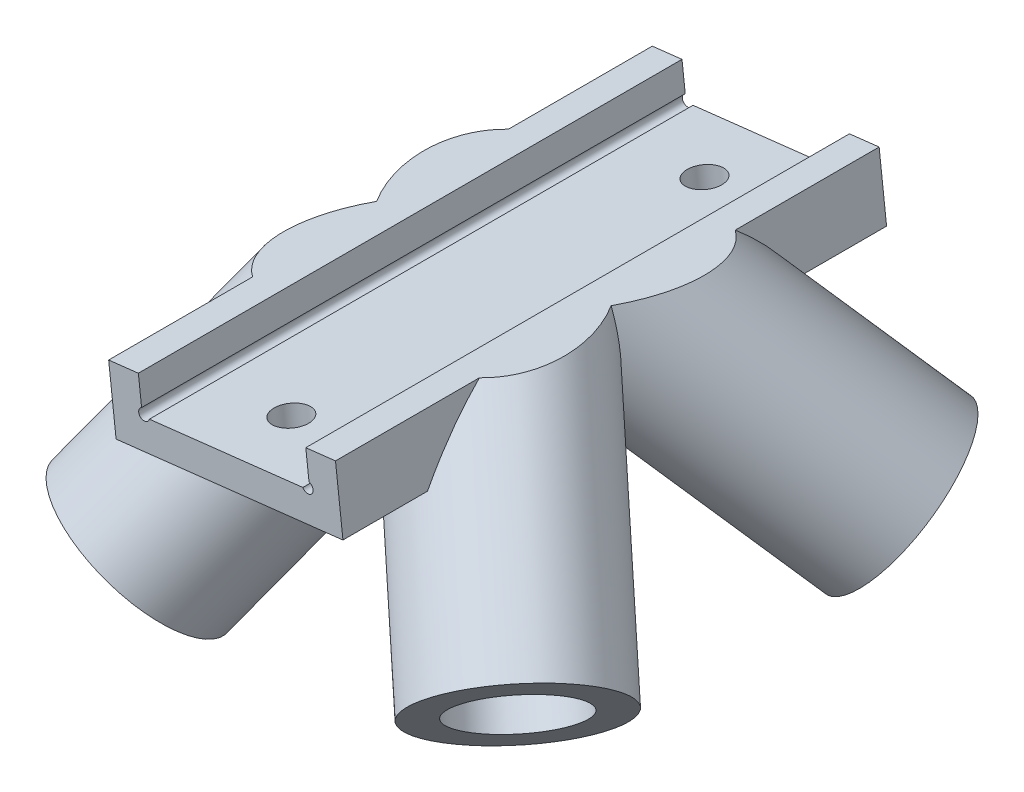
ISO-10303-21;
HEADER;
FILE_DESCRIPTION(('STEP AP214'),'2;1');
FILE_NAME('part.step','',(''),(''),'','','');
FILE_SCHEMA(('AUTOMOTIVE_DESIGN { 1 0 10303 214 1 1 1 1 }'));
ENDSEC;
DATA;
#1=APPLICATION_CONTEXT('core data for automotive mechanical design processes');
#2=APPLICATION_PROTOCOL_DEFINITION('international standard','automotive_design',2000,#1);
#3=PRODUCT_CONTEXT('',#1,'mechanical');
#4=PRODUCT('Part','Part','',(#3));
#5=PRODUCT_RELATED_PRODUCT_CATEGORY('part','',(#4));
#6=PRODUCT_DEFINITION_FORMATION('','',#4);
#7=PRODUCT_DEFINITION_CONTEXT('part definition',#1,'design');
#8=PRODUCT_DEFINITION('design','',#6,#7);
#9=PRODUCT_DEFINITION_SHAPE('','',#8);
#10=(LENGTH_UNIT() NAMED_UNIT(*) SI_UNIT(.MILLI.,.METRE.));
#11=(NAMED_UNIT(*) PLANE_ANGLE_UNIT() SI_UNIT($,.RADIAN.));
#12=(NAMED_UNIT(*) SI_UNIT($,.STERADIAN.) SOLID_ANGLE_UNIT());
#13=UNCERTAINTY_MEASURE_WITH_UNIT(LENGTH_MEASURE(1.E-05),#10,'distance_accuracy_value','');
#14=(GEOMETRIC_REPRESENTATION_CONTEXT(3) GLOBAL_UNCERTAINTY_ASSIGNED_CONTEXT((#13)) GLOBAL_UNIT_ASSIGNED_CONTEXT((#10,
#11,#12)) REPRESENTATION_CONTEXT('',''));
#15=CARTESIAN_POINT('',(0.,0.,0.));
#16=DIRECTION('',(0.,0.,1.));
#17=DIRECTION('',(1.,0.,0.));
#18=AXIS2_PLACEMENT_3D('',#15,#16,#17);
#19=CARTESIAN_POINT('',(-11.6292554105229,9.2336568377227,25.));
#20=DIRECTION('',(0.99347201182122,0.114076122514297,0.));
#21=DIRECTION('',(-0.114076122514297,0.993472011821221,0.));
#22=AXIS2_PLACEMENT_3D('',#19,#20,#21);
#23=PLANE('',#22);
#24=DIRECTION('',(0.114076122514297,-0.99347201182122,0.));
#25=VECTOR('',#24,1.);
#26=CARTESIAN_POINT('',(-11.6292554105229,9.2336568377227,25.));
#27=LINE('',#26,#25);
#28=CARTESIAN_POINT('',(-9.91811357280848,-5.6684233395956,25.));
#29=VERTEX_POINT('',#28);
#30=CARTESIAN_POINT('',(-9.2336568377227,-11.6292554105229,25.));
#31=VERTEX_POINT('',#30);
#32=EDGE_CURVE('E218',#29,#31,#27,.T.);
#33=ORIENTED_EDGE('',*,*,#32,.F.);
#34=DIRECTION('',(0.,0.,-1.));
#35=VECTOR('',#34,1.);
#36=CARTESIAN_POINT('',(-9.91811357280848,-5.6684233395956,25.));
#37=LINE('',#36,#35);
#38=CARTESIAN_POINT('',(-9.91811357280848,-5.6684233395956,11.7638200751838));
#39=VERTEX_POINT('',#38);
#40=EDGE_CURVE('E202',#29,#39,#37,.T.);
#41=ORIENTED_EDGE('',*,*,#40,.T.);
#42=CARTESIAN_POINT('',(-8.73751212829496,-15.9501060124345,10.4999999999999));
#43=DIRECTION('',(0.99347201182122,0.114076122514297,0.));
#44=DIRECTION('',(-0.093142763998416,0.811166500899417,-0.577350269189624));
#45=AXIS2_PLACEMENT_3D('',#42,#43,#44);
#46=ELLIPSE('',#45,16.,8.);
#47=CARTESIAN_POINT('',(-9.2336568377227,-11.6292554105229,17.2205092622377));
#48=VERTEX_POINT('',#47);
#49=EDGE_CURVE('E251',#48,#39,#46,.F.);
#50=ORIENTED_EDGE('',*,*,#49,.F.);
#51=DIRECTION('',(0.,0.,-1.));
#52=VECTOR('',#51,1.);
#53=CARTESIAN_POINT('',(-9.2336568377227,-11.6292554105229,25.));
#54=LINE('',#53,#52);
#55=EDGE_CURVE('E226',#31,#48,#54,.T.);
#56=ORIENTED_EDGE('',*,*,#55,.F.);
#57=EDGE_LOOP('',(#33,#41,#50,#56));
#58=FACE_BOUND('',#57,.T.);
#59=ADVANCED_FACE('F89',(#58),#23,.F.);
#60=CARTESIAN_POINT('',(9.2336568377227,11.6292554105229,25.));
#61=DIRECTION('',(0.99347201182122,0.114076122514297,0.));
#62=DIRECTION('',(-0.114076122514297,0.993472011821221,0.));
#63=AXIS2_PLACEMENT_3D('',#60,#61,#62);
#64=PLANE('',#63);
#65=DIRECTION('',(0.,0.,-1.));
#66=VECTOR('',#65,1.);
#67=CARTESIAN_POINT('',(10.9447986754372,-3.27282476679537,25.));
#68=LINE('',#67,#66);
#69=CARTESIAN_POINT('',(10.9447986754371,-3.27282476679537,25.));
#70=VERTEX_POINT('',#69);
#71=CARTESIAN_POINT('',(10.9447986754372,-3.27282476679537,11.7638200751838));
#72=VERTEX_POINT('',#71);
#73=EDGE_CURVE('E317',#70,#72,#68,.T.);
#74=ORIENTED_EDGE('',*,*,#73,.F.);
#75=DIRECTION('',(0.114076122514297,-0.99347201182122,0.));
#76=VECTOR('',#75,1.);
#77=CARTESIAN_POINT('',(9.2336568377227,11.6292554105229,25.));
#78=LINE('',#77,#76);
#79=CARTESIAN_POINT('',(11.6292554105229,-9.2336568377227,25.));
#80=VERTEX_POINT('',#79);
#81=EDGE_CURVE('E241',#70,#80,#78,.T.);
#82=ORIENTED_EDGE('',*,*,#81,.T.);
#83=DIRECTION('',(0.,0.,-1.));
#84=VECTOR('',#83,1.);
#85=CARTESIAN_POINT('',(11.6292554105229,-9.2336568377227,25.));
#86=LINE('',#85,#84);
#87=CARTESIAN_POINT('',(11.6292554105229,-9.2336568377227,17.2205092622377));
#88=VERTEX_POINT('',#87);
#89=EDGE_CURVE('E248',#80,#88,#86,.T.);
#90=ORIENTED_EDGE('',*,*,#89,.T.);
#91=CARTESIAN_POINT('',(12.1254001199507,-13.5545074396342,10.4999999999999));
#92=DIRECTION('',(0.99347201182122,0.114076122514297,0.));
#93=DIRECTION('',(-0.0931427639984159,0.811166500899417,-0.577350269189624));
#94=AXIS2_PLACEMENT_3D('',#91,#92,#93);
#95=ELLIPSE('',#94,16.,8.);
#96=EDGE_CURVE('E244',#88,#72,#95,.F.);
#97=ORIENTED_EDGE('',*,*,#96,.T.);
#98=EDGE_LOOP('',(#74,#82,#90,#97));
#99=FACE_BOUND('',#98,.T.);
#100=ADVANCED_FACE('F389',(#99),#64,.T.);
#101=CARTESIAN_POINT('',(11.6292554105229,-9.2336568377227,25.));
#102=DIRECTION('',(0.114076122514297,-0.99347201182122,0.));
#103=DIRECTION('',(0.993472011821221,0.114076122514297,0.));
#104=AXIS2_PLACEMENT_3D('',#101,#102,#103);
#105=PLANE('',#104);
#106=ORIENTED_EDGE('',*,*,#55,.T.);
#107=CARTESIAN_POINT('',(-6.17835407661707,-11.2784281220367,7.42462120245871));
#108=DIRECTION('',(0.114076122514297,-0.99347201182122,0.));
#109=DIRECTION('',(0.702490796477829,0.0806639998013268,-0.707106781186545));
#110=AXIS2_PLACEMENT_3D('',#107,#108,#109);
#111=ELLIPSE('',#110,11.3137084989847,8.);
#112=CARTESIAN_POINT('',(1.19779928640012,-10.4314561241228,10.9774612416475));
#113=VERTEX_POINT('',#112);
#114=EDGE_CURVE('E230',#48,#113,#111,.F.);
#115=ORIENTED_EDGE('',*,*,#114,.T.);
#116=CARTESIAN_POINT('',(8.57395264941731,-9.58448412620888,7.42462120245871));
#117=DIRECTION('',(0.114076122514297,-0.99347201182122,0.));
#118=DIRECTION('',(-0.702490796477829,-0.0806639998013269,-0.707106781186545));
#119=AXIS2_PLACEMENT_3D('',#116,#117,#118);
#120=ELLIPSE('',#119,11.3137084989848,8.);
#121=EDGE_CURVE('E240',#113,#88,#120,.F.);
#122=ORIENTED_EDGE('',*,*,#121,.T.);
#123=ORIENTED_EDGE('',*,*,#89,.F.);
#124=DIRECTION('',(-0.99347201182122,-0.114076122514297,0.));
#125=VECTOR('',#124,1.);
#126=CARTESIAN_POINT('',(11.6292554105229,-9.2336568377227,25.));
#127=LINE('',#126,#125);
#128=EDGE_CURVE('E237',#80,#31,#127,.T.);
#129=ORIENTED_EDGE('',*,*,#128,.T.);
#130=EDGE_LOOP('',(#106,#115,#122,#123,#129));
#131=FACE_BOUND('',#130,.T.);
#132=CARTESIAN_POINT('',(1.19779928640012,-10.4314561241228,19.));
#133=DIRECTION('',(-0.114076122514297,0.99347201182122,0.));
#134=DIRECTION('',(-0.99347201182122,-0.114076122514297,0.));
#135=AXIS2_PLACEMENT_3D('',#132,#133,#134);
#136=CIRCLE('',#135,1.6);
#137=CARTESIAN_POINT('',(-0.391755932513838,-10.6139779201457,19.));
#138=VERTEX_POINT('',#137);
#139=EDGE_CURVE('E233',#138,#138,#136,.T.);
#140=ORIENTED_EDGE('',*,*,#139,.T.);
#141=EDGE_LOOP('',(#140));
#142=FACE_BOUND('',#141,.T.);
#143=ADVANCED_FACE('F392',(#131,#142),#105,.T.);
#144=CARTESIAN_POINT('',(0.884089949485796,-7.69940809161446,0.));
#145=DIRECTION('',(0.114076122514296,-0.99347201182122,0.));
#146=DIRECTION('',(0.99347201182122,0.114076122514296,0.));
#147=AXIS2_PLACEMENT_3D('',#144,#145,#146);
#148=PLANE('',#147);
#149=DIRECTION('',(0.993472011821221,0.114076122514296,0.));
#150=VECTOR('',#149,1.);
#151=CARTESIAN_POINT('',(0.884089949485797,-7.69940809161446,25.));
#152=LINE('',#151,#150);
#153=CARTESIAN_POINT('',(-6.17504145656119,-8.5099778203424,25.));
#154=VERTEX_POINT('',#153);
#155=CARTESIAN_POINT('',(7.9432213555328,-6.88883836288651,25.));
#156=VERTEX_POINT('',#155);
#157=EDGE_CURVE('E289',#154,#156,#152,.T.);
#158=ORIENTED_EDGE('',*,*,#157,.T.);
#159=DIRECTION('',(0.,0.,1.));
#160=VECTOR('',#159,1.);
#161=CARTESIAN_POINT('',(7.9432213555328,-6.88883836288651,0.));
#162=LINE('',#161,#160);
#163=CARTESIAN_POINT('',(7.9432213555328,-6.88883836288651,-25.));
#164=VERTEX_POINT('',#163);
#165=EDGE_CURVE('E283',#164,#156,#162,.T.);
#166=ORIENTED_EDGE('',*,*,#165,.F.);
#167=DIRECTION('',(0.993472011821221,0.114076122514296,0.));
#168=VECTOR('',#167,1.);
#169=CARTESIAN_POINT('',(0.884089949485797,-7.69940809161446,-25.));
#170=LINE('',#169,#168);
#171=CARTESIAN_POINT('',(-6.17504145656119,-8.5099778203424,-25.));
#172=VERTEX_POINT('',#171);
#173=EDGE_CURVE('E379',#172,#164,#170,.T.);
#174=ORIENTED_EDGE('',*,*,#173,.F.);
#175=DIRECTION('',(0.,0.,1.));
#176=VECTOR('',#175,1.);
#177=CARTESIAN_POINT('',(-6.17504145656119,-8.5099778203424,0.));
#178=LINE('',#177,#176);
#179=EDGE_CURVE('E286',#172,#154,#178,.T.);
#180=ORIENTED_EDGE('',*,*,#179,.T.);
#181=EDGE_LOOP('',(#158,#166,#174,#180));
#182=FACE_BOUND('',#181,.T.);
#183=CARTESIAN_POINT('',(0.8840899494858,-7.69940809161446,19.));
#184=DIRECTION('',(0.114076122514296,-0.99347201182122,0.));
#185=DIRECTION('',(0.99347201182122,0.114076122514296,0.));
#186=AXIS2_PLACEMENT_3D('',#183,#184,#185);
#187=CIRCLE('',#186,1.6);
#188=CARTESIAN_POINT('',(2.47364516839975,-7.51688629559159,19.));
#189=VERTEX_POINT('',#188);
#190=EDGE_CURVE('E228',#189,#189,#187,.T.);
#191=ORIENTED_EDGE('',*,*,#190,.T.);
#192=EDGE_LOOP('',(#191));
#193=FACE_BOUND('',#192,.T.);
#194=CARTESIAN_POINT('',(0.8840899494858,-7.69940809161446,-19.));
#195=DIRECTION('',(-0.114076122514296,0.99347201182122,0.));
#196=DIRECTION('',(0.99347201182122,0.114076122514296,0.));
#197=AXIS2_PLACEMENT_3D('',#194,#195,#196);
#198=CIRCLE('',#197,1.6);
#199=CARTESIAN_POINT('',(2.47364516839975,-7.51688629559159,-19.));
#200=VERTEX_POINT('',#199);
#201=EDGE_CURVE('E324',#200,#200,#198,.T.);
#202=ORIENTED_EDGE('',*,*,#201,.F.);
#203=EDGE_LOOP('',(#202));
#204=FACE_BOUND('',#203,.T.);
#205=ADVANCED_FACE('F425',(#182,#193,#204),#148,.F.);
#206=CARTESIAN_POINT('',(0.,0.,25.));
#207=DIRECTION('',(0.,0.,-1.));
#208=DIRECTION('',(0.,1.,0.));
#209=AXIS2_PLACEMENT_3D('',#206,#207,#208);
#210=PLANE('',#209);
#211=ORIENTED_EDGE('',*,*,#81,.F.);
#212=DIRECTION('',(0.993472011821221,0.114076122514297,0.));
#213=VECTOR('',#212,1.);
#214=CARTESIAN_POINT('',(-31.0408053589941,-8.09385128055532,25.));
#215=LINE('',#214,#213);
#216=CARTESIAN_POINT('',(8.2127506429288,-3.58653410370968,25.));
#217=VERTEX_POINT('',#216);
#218=EDGE_CURVE('E223',#217,#70,#215,.T.);
#219=ORIENTED_EDGE('',*,*,#218,.F.);
#220=DIRECTION('',(-0.114076122514297,0.993472011821221,0.));
#221=VECTOR('',#220,1.);
#222=CARTESIAN_POINT('',(7.69940809161447,0.884089949485802,25.));
#223=LINE('',#222,#221);
#224=CARTESIAN_POINT('',(8.50997782034242,-6.1750414565612,25.));
#225=VERTEX_POINT('',#224);
#226=EDGE_CURVE('E285',#225,#217,#223,.T.);
#227=ORIENTED_EDGE('',*,*,#226,.F.);
#228=CARTESIAN_POINT('',(8.38770934203048,-6.65986144295953,25.));
#229=DIRECTION('',(0.,0.,1.));
#230=DIRECTION('',(1.,0.,0.));
#231=AXIS2_PLACEMENT_3D('',#228,#229,#230);
#232=CIRCLE('',#231,0.500000000000002);
#233=EDGE_CURVE('E280',#156,#225,#232,.T.);
#234=ORIENTED_EDGE('',*,*,#233,.F.);
#235=ORIENTED_EDGE('',*,*,#157,.F.);
#236=CARTESIAN_POINT('',(-6.65986144295953,-8.38770934203047,25.));
#237=DIRECTION('',(0.,0.,1.));
#238=DIRECTION('',(1.,0.,0.));
#239=AXIS2_PLACEMENT_3D('',#236,#237,#238);
#240=CIRCLE('',#239,0.5);
#241=CARTESIAN_POINT('',(-6.88883836288651,-7.94322135553281,25.));
#242=VERTEX_POINT('',#241);
#243=EDGE_CURVE('E276',#242,#154,#240,.T.);
#244=ORIENTED_EDGE('',*,*,#243,.F.);
#245=DIRECTION('',(0.114076122514297,-0.993472011821221,0.));
#246=VECTOR('',#245,1.);
#247=CARTESIAN_POINT('',(-7.69940809161447,-0.884089949485802,25.));
#248=LINE('',#247,#246);
#249=CARTESIAN_POINT('',(-7.18606554030013,-5.35471400268129,25.));
#250=VERTEX_POINT('',#249);
#251=EDGE_CURVE('E221',#250,#242,#248,.T.);
#252=ORIENTED_EDGE('',*,*,#251,.F.);
#253=EDGE_CURVE('E205',#29,#250,#215,.T.);
#254=ORIENTED_EDGE('',*,*,#253,.F.);
#255=ORIENTED_EDGE('',*,*,#32,.T.);
#256=ORIENTED_EDGE('',*,*,#128,.F.);
#257=EDGE_LOOP('',(#211,#219,#227,#234,#235,#244,#252,#254,#255,#256));
#258=FACE_BOUND('',#257,.T.);
#259=ADVANCED_FACE('F91',(#258),#210,.F.);
#260=CARTESIAN_POINT('',(-8.73751212829496,-15.9501060124345,-10.4999999999999));
#261=DIRECTION('',(-0.99347201182122,-0.114076122514297,0.));
#262=DIRECTION('',(-0.093142763998416,0.811166500899417,0.577350269189624));
#263=AXIS2_PLACEMENT_3D('',#260,#261,#262);
#264=ELLIPSE('',#263,16.,8.);
#265=CARTESIAN_POINT('',(-9.2336568377227,-11.6292554105229,-17.2205092622377));
#266=VERTEX_POINT('',#265);
#267=CARTESIAN_POINT('',(-9.91811357280848,-5.6684233395956,-11.7638200751838));
#268=VERTEX_POINT('',#267);
#269=EDGE_CURVE('E352',#266,#268,#264,.F.);
#270=ORIENTED_EDGE('',*,*,#269,.T.);
#271=CARTESIAN_POINT('',(-9.91811357280848,-5.6684233395956,-25.));
#272=VERTEX_POINT('',#271);
#273=EDGE_CURVE('E112',#268,#272,#37,.T.);
#274=ORIENTED_EDGE('',*,*,#273,.T.);
#275=DIRECTION('',(0.114076122514297,-0.99347201182122,0.));
#276=VECTOR('',#275,1.);
#277=CARTESIAN_POINT('',(-11.6292554105229,9.2336568377227,-25.));
#278=LINE('',#277,#276);
#279=CARTESIAN_POINT('',(-9.2336568377227,-11.6292554105229,-25.));
#280=VERTEX_POINT('',#279);
#281=EDGE_CURVE('E327',#272,#280,#278,.T.);
#282=ORIENTED_EDGE('',*,*,#281,.T.);
#283=DIRECTION('',(0.,0.,1.));
#284=VECTOR('',#283,1.);
#285=CARTESIAN_POINT('',(-9.2336568377227,-11.6292554105229,-25.));
#286=LINE('',#285,#284);
#287=EDGE_CURVE('E335',#280,#266,#286,.T.);
#288=ORIENTED_EDGE('',*,*,#287,.T.);
#289=EDGE_LOOP('',(#270,#274,#282,#288));
#290=FACE_BOUND('',#289,.T.);
#291=ADVANCED_FACE('F449',(#290),#23,.F.);
#292=CARTESIAN_POINT('',(20.2090001999178,-22.5908457327238,17.4999999999999));
#293=DIRECTION('',(-0.577400005711938,0.645452735220679,-0.499999999999998));
#294=DIRECTION('',(-0.745304620857677,-0.666724097455757,0.));
#295=AXIS2_PLACEMENT_3D('',#292,#293,#294);
#296=CYLINDRICAL_SURFACE('',#295,8.);
#297=CARTESIAN_POINT('',(20.2090001999178,-22.5908457327238,17.4999999999999));
#298=DIRECTION('',(0.577400005711938,-0.645452735220679,0.499999999999998));
#299=DIRECTION('',(0.745304620857677,0.666724097455757,0.));
#300=AXIS2_PLACEMENT_3D('',#297,#298,#299);
#301=CIRCLE('',#300,8.);
#302=CARTESIAN_POINT('',(26.1714371667793,-17.2570529530777,17.4999999999999));
#303=VERTEX_POINT('',#302);
#304=EDGE_CURVE('E243',#303,#303,#301,.T.);
#305=ORIENTED_EDGE('',*,*,#304,.F.);
#306=EDGE_LOOP('',(#305));
#307=FACE_BOUND('',#306,.T.);
#308=CARTESIAN_POINT('',(0.,0.,0.));
#309=DIRECTION('',(0.,0.,1.));
#310=DIRECTION('',(-0.666724097455757,0.745304620857677,0.));
#311=AXIS2_PLACEMENT_3D('',#308,#309,#310);
#312=ELLIPSE('',#311,16.0000000000001,8.);
#313=CARTESIAN_POINT('',(1.29062399682123,-11.2398527436452,0.));
#314=VERTEX_POINT('',#313);
#315=CARTESIAN_POINT('',(11.3006755418618,-3.23196095530274,0.));
#316=VERTEX_POINT('',#315);
#317=EDGE_CURVE('E239',#314,#316,#312,.T.);
#318=ORIENTED_EDGE('',*,*,#317,.T.);
#319=CARTESIAN_POINT('',(3.67455113546455,-4.10763605408952,3.18198051533944));
#320=DIRECTION('',(0.114076122514297,-0.99347201182122,0.));
#321=DIRECTION('',(-0.702490796477829,-0.0806639998013269,-0.707106781186545));
#322=AXIS2_PLACEMENT_3D('',#319,#320,#321);
#323=ELLIPSE('',#322,11.3137084989848,8.);
#324=EDGE_CURVE('E104',#316,#72,#323,.T.);
#325=ORIENTED_EDGE('',*,*,#324,.T.);
#326=ORIENTED_EDGE('',*,*,#96,.F.);
#327=ORIENTED_EDGE('',*,*,#121,.F.);
#328=CARTESIAN_POINT('',(0.,0.,0.));
#329=DIRECTION('',(-0.99347201182122,-0.114076122514297,0.));
#330=DIRECTION('',(-0.093142763998416,0.811166500899417,-0.577350269189624));
#331=AXIS2_PLACEMENT_3D('',#328,#329,#330);
#332=ELLIPSE('',#331,16.,8.);
#333=EDGE_CURVE('E256',#314,#113,#332,.T.);
#334=ORIENTED_EDGE('',*,*,#333,.F.);
#335=EDGE_LOOP('',(#318,#325,#326,#327,#334));
#336=FACE_BOUND('',#335,.T.);
#337=ADVANCED_FACE('F398',(#307,#336),#296,.T.);
#338=CARTESIAN_POINT('',(10.9447986754372,-3.27282476679537,-11.7638200751838));
#339=VERTEX_POINT('',#338);
#340=CARTESIAN_POINT('',(10.9447986754372,-3.27282476679537,-25.));
#341=VERTEX_POINT('',#340);
#342=EDGE_CURVE('E315',#339,#341,#68,.T.);
#343=ORIENTED_EDGE('',*,*,#342,.F.);
#344=CARTESIAN_POINT('',(12.1254001199507,-13.5545074396342,-10.4999999999999));
#345=DIRECTION('',(-0.99347201182122,-0.114076122514297,0.));
#346=DIRECTION('',(-0.0931427639984159,0.811166500899417,0.577350269189624));
#347=AXIS2_PLACEMENT_3D('',#344,#345,#346);
#348=ELLIPSE('',#347,16.,8.);
#349=CARTESIAN_POINT('',(11.6292554105229,-9.2336568377227,-17.2205092622377));
#350=VERTEX_POINT('',#349);
#351=EDGE_CURVE('E333',#350,#339,#348,.F.);
#352=ORIENTED_EDGE('',*,*,#351,.F.);
#353=DIRECTION('',(0.,0.,1.));
#354=VECTOR('',#353,1.);
#355=CARTESIAN_POINT('',(11.6292554105229,-9.2336568377227,-25.));
#356=LINE('',#355,#354);
#357=CARTESIAN_POINT('',(11.6292554105229,-9.2336568377227,-25.));
#358=VERTEX_POINT('',#357);
#359=EDGE_CURVE('E330',#358,#350,#356,.T.);
#360=ORIENTED_EDGE('',*,*,#359,.F.);
#361=DIRECTION('',(0.114076122514297,-0.99347201182122,0.));
#362=VECTOR('',#361,1.);
#363=CARTESIAN_POINT('',(9.2336568377227,11.6292554105229,-25.));
#364=LINE('',#363,#362);
#365=EDGE_CURVE('E343',#341,#358,#364,.T.);
#366=ORIENTED_EDGE('',*,*,#365,.F.);
#367=EDGE_LOOP('',(#343,#352,#360,#366));
#368=FACE_BOUND('',#367,.T.);
#369=ADVANCED_FACE('F408',(#368),#64,.T.);
#370=CARTESIAN_POINT('',(20.2090001999178,-22.5908457327238,17.4999999999999));
#371=DIRECTION('',(0.577400005711938,-0.645452735220679,0.499999999999998));
#372=DIRECTION('',(0.745304620857677,0.666724097455757,0.));
#373=AXIS2_PLACEMENT_3D('',#370,#371,#372);
#374=PLANE('',#373);
#375=CARTESIAN_POINT('',(20.2090001999178,-22.5908457327238,17.4999999999999));
#376=DIRECTION('',(0.577400005711938,-0.645452735220679,0.499999999999998));
#377=DIRECTION('',(0.745304620857677,0.666724097455757,0.));
#378=AXIS2_PLACEMENT_3D('',#375,#376,#377);
#379=CIRCLE('',#378,5.1);
#380=CARTESIAN_POINT('',(24.010053766292,-19.1905528356994,17.4999999999999));
#381=VERTEX_POINT('',#380);
#382=EDGE_CURVE('E261',#381,#381,#379,.T.);
#383=ORIENTED_EDGE('',*,*,#382,.F.);
#384=EDGE_LOOP('',(#383));
#385=FACE_BOUND('',#384,.T.);
#386=ORIENTED_EDGE('',*,*,#304,.T.);
#387=EDGE_LOOP('',(#386));
#388=FACE_BOUND('',#387,.T.);
#389=ADVANCED_FACE('F507',(#385,#388),#374,.T.);
#390=CARTESIAN_POINT('',(-14.562520213825,-26.5835100207242,17.4999999999999));
#391=DIRECTION('',(0.416072006109285,0.759528857734976,-0.499999999999998));
#392=DIRECTION('',(0.,0.549854378326683,0.835260535782086));
#393=AXIS2_PLACEMENT_3D('',#390,#391,#392);
#394=CYLINDRICAL_SURFACE('',#393,8.);
#395=ORIENTED_EDGE('',*,*,#49,.T.);
#396=CARTESIAN_POINT('',(-2.64786603283588,-4.83361205230145,3.18198051533944));
#397=DIRECTION('',(0.114076122514297,-0.99347201182122,0.));
#398=DIRECTION('',(0.702490796477829,0.0806639998013269,-0.707106781186545));
#399=AXIS2_PLACEMENT_3D('',#396,#397,#398);
#400=ELLIPSE('',#399,11.3137084989847,8.);
#401=CARTESIAN_POINT('',(-10.2739904392331,-5.70928715108823,0.));
#402=VERTEX_POINT('',#401);
#403=EDGE_CURVE('E208',#39,#402,#400,.T.);
#404=ORIENTED_EDGE('',*,*,#403,.T.);
#405=CARTESIAN_POINT('',(0.,0.,0.));
#406=DIRECTION('',(0.,0.,1.));
#407=DIRECTION('',(0.480438569458925,0.877028380941154,0.));
#408=AXIS2_PLACEMENT_3D('',#405,#406,#407);
#409=ELLIPSE('',#408,16.0000000000001,8.);
#410=EDGE_CURVE('E253',#402,#314,#409,.T.);
#411=ORIENTED_EDGE('',*,*,#410,.T.);
#412=ORIENTED_EDGE('',*,*,#333,.T.);
#413=ORIENTED_EDGE('',*,*,#114,.F.);
#414=EDGE_LOOP('',(#395,#404,#411,#412,#413));
#415=FACE_BOUND('',#414,.T.);
#416=CARTESIAN_POINT('',(-14.562520213825,-26.5835100207242,17.4999999999999));
#417=DIRECTION('',(-0.416072006109285,-0.759528857734976,0.499999999999998));
#418=DIRECTION('',(0.,-0.549854378326683,-0.835260535782086));
#419=AXIS2_PLACEMENT_3D('',#416,#417,#418);
#420=CIRCLE('',#419,8.);
#421=CARTESIAN_POINT('',(-14.562520213825,-30.9823450473376,10.8179157137432));
#422=VERTEX_POINT('',#421);
#423=EDGE_CURVE('E258',#422,#422,#420,.T.);
#424=ORIENTED_EDGE('',*,*,#423,.F.);
#425=EDGE_LOOP('',(#424));
#426=FACE_BOUND('',#425,.T.);
#427=ADVANCED_FACE('F549',(#415,#426),#394,.T.);
#428=CARTESIAN_POINT('',(-14.562520213825,-26.5835100207242,17.4999999999999));
#429=DIRECTION('',(-0.416072006109285,-0.759528857734976,0.499999999999998));
#430=DIRECTION('',(0.,-0.549854378326683,-0.835260535782086));
#431=AXIS2_PLACEMENT_3D('',#428,#429,#430);
#432=PLANE('',#431);
#433=CARTESIAN_POINT('',(-14.562520213825,-26.5835100207242,17.4999999999999));
#434=DIRECTION('',(-0.416072006109284,-0.759528857734976,0.499999999999998));
#435=DIRECTION('',(0.,-0.549854378326683,-0.835260535782085));
#436=AXIS2_PLACEMENT_3D('',#433,#434,#435);
#437=CIRCLE('',#436,5.1);
#438=CARTESIAN_POINT('',(-14.562520213825,-29.3877673501903,13.2401712675113));
#439=VERTEX_POINT('',#438);
#440=EDGE_CURVE('E270',#439,#439,#437,.T.);
#441=ORIENTED_EDGE('',*,*,#440,.F.);
#442=EDGE_LOOP('',(#441));
#443=FACE_BOUND('',#442,.T.);
#444=ORIENTED_EDGE('',*,*,#423,.T.);
#445=EDGE_LOOP('',(#444));
#446=FACE_BOUND('',#445,.T.);
#447=ADVANCED_FACE('F554',(#443,#446),#432,.T.);
#448=CARTESIAN_POINT('',(10.3932001028149,-11.6181492339722,8.99999999999996));
#449=DIRECTION('',(0.577400005711938,-0.645452735220679,0.499999999999998));
#450=DIRECTION('',(0.745304620857677,0.666724097455757,0.));
#451=AXIS2_PLACEMENT_3D('',#448,#449,#450);
#452=CYLINDRICAL_SURFACE('',#451,5.1);
#453=CARTESIAN_POINT('',(10.3932001028149,-11.6181492339722,8.99999999999996));
#454=DIRECTION('',(0.577400005711938,-0.645452735220679,0.499999999999998));
#455=DIRECTION('',(0.745304620857677,0.666724097455757,0.));
#456=AXIS2_PLACEMENT_3D('',#453,#454,#455);
#457=CIRCLE('',#456,5.1);
#458=CARTESIAN_POINT('',(14.194253669189,-8.21785633694786,8.99999999999996));
#459=VERTEX_POINT('',#458);
#460=EDGE_CURVE('E267',#459,#459,#457,.T.);
#461=ORIENTED_EDGE('',*,*,#460,.F.);
#462=EDGE_LOOP('',(#461));
#463=FACE_BOUND('',#462,.T.);
#464=ORIENTED_EDGE('',*,*,#382,.T.);
#465=EDGE_LOOP('',(#464));
#466=FACE_BOUND('',#465,.T.);
#467=ADVANCED_FACE('F689',(#463,#466),#452,.F.);
#468=CARTESIAN_POINT('',(10.3932001028149,-11.6181492339722,8.99999999999996));
#469=DIRECTION('',(0.577400005711938,-0.645452735220679,0.499999999999998));
#470=DIRECTION('',(0.745304620857677,0.666724097455757,0.));
#471=AXIS2_PLACEMENT_3D('',#468,#469,#470);
#472=PLANE('',#471);
#473=ORIENTED_EDGE('',*,*,#460,.T.);
#474=EDGE_LOOP('',(#473));
#475=FACE_BOUND('',#474,.T.);
#476=ADVANCED_FACE('F681',(#475),#472,.T.);
#477=CARTESIAN_POINT('',(-7.48929610996714,-13.6715194392296,8.99999999999998));
#478=DIRECTION('',(-0.416072006109285,-0.759528857734976,0.499999999999998));
#479=DIRECTION('',(0.,-0.549854378326683,-0.835260535782086));
#480=AXIS2_PLACEMENT_3D('',#477,#478,#479);
#481=CYLINDRICAL_SURFACE('',#480,5.1);
#482=CARTESIAN_POINT('',(-7.48929610996714,-13.6715194392296,8.99999999999998));
#483=DIRECTION('',(-0.416072006109284,-0.759528857734976,0.499999999999998));
#484=DIRECTION('',(0.,-0.549854378326683,-0.835260535782085));
#485=AXIS2_PLACEMENT_3D('',#482,#483,#484);
#486=CIRCLE('',#485,5.1);
#487=CARTESIAN_POINT('',(-7.48929610996714,-16.4757767686957,4.74017126751134));
#488=VERTEX_POINT('',#487);
#489=EDGE_CURVE('E273',#488,#488,#486,.T.);
#490=ORIENTED_EDGE('',*,*,#489,.F.);
#491=EDGE_LOOP('',(#490));
#492=FACE_BOUND('',#491,.T.);
#493=ORIENTED_EDGE('',*,*,#440,.T.);
#494=EDGE_LOOP('',(#493));
#495=FACE_BOUND('',#494,.T.);
#496=ADVANCED_FACE('F674',(#492,#495),#481,.F.);
#497=CARTESIAN_POINT('',(-7.48929610996714,-13.6715194392296,8.99999999999998));
#498=DIRECTION('',(-0.416072006109284,-0.759528857734976,0.499999999999998));
#499=DIRECTION('',(0.,-0.549854378326683,-0.835260535782085));
#500=AXIS2_PLACEMENT_3D('',#497,#498,#499);
#501=PLANE('',#500);
#502=ORIENTED_EDGE('',*,*,#489,.T.);
#503=EDGE_LOOP('',(#502));
#504=FACE_BOUND('',#503,.T.);
#505=ADVANCED_FACE('F665',(#504),#501,.T.);
#506=CARTESIAN_POINT('',(-6.65986144295953,-8.38770934203047,0.));
#507=DIRECTION('',(0.,0.,1.));
#508=DIRECTION('',(0.,-1.,0.));
#509=AXIS2_PLACEMENT_3D('',#506,#507,#508);
#510=CYLINDRICAL_SURFACE('',#509,0.5);
#511=ORIENTED_EDGE('',*,*,#243,.T.);
#512=ORIENTED_EDGE('',*,*,#179,.F.);
#513=CARTESIAN_POINT('',(-6.65986144295953,-8.38770934203048,-25.));
#514=DIRECTION('',(0.,0.,1.));
#515=DIRECTION('',(1.,0.,0.));
#516=AXIS2_PLACEMENT_3D('',#513,#514,#515);
#517=CIRCLE('',#516,0.5);
#518=CARTESIAN_POINT('',(-6.88883836288651,-7.94322135553281,-25.));
#519=VERTEX_POINT('',#518);
#520=EDGE_CURVE('E374',#519,#172,#517,.T.);
#521=ORIENTED_EDGE('',*,*,#520,.F.);
#522=DIRECTION('',(0.,0.,1.));
#523=VECTOR('',#522,1.);
#524=CARTESIAN_POINT('',(-6.88883836288651,-7.94322135553281,0.));
#525=LINE('',#524,#523);
#526=EDGE_CURVE('E279',#519,#242,#525,.T.);
#527=ORIENTED_EDGE('',*,*,#526,.T.);
#528=EDGE_LOOP('',(#511,#512,#521,#527));
#529=FACE_BOUND('',#528,.T.);
#530=ADVANCED_FACE('F422',(#529),#510,.F.);
#531=CARTESIAN_POINT('',(8.38770934203048,-6.65986144295953,0.));
#532=DIRECTION('',(0.,0.,1.));
#533=DIRECTION('',(0.,-1.,0.));
#534=AXIS2_PLACEMENT_3D('',#531,#532,#533);
#535=CYLINDRICAL_SURFACE('',#534,0.500000000000002);
#536=ORIENTED_EDGE('',*,*,#233,.T.);
#537=DIRECTION('',(0.,0.,1.));
#538=VECTOR('',#537,1.);
#539=CARTESIAN_POINT('',(8.50997782034242,-6.1750414565612,0.));
#540=LINE('',#539,#538);
#541=CARTESIAN_POINT('',(8.50997782034242,-6.1750414565612,-25.));
#542=VERTEX_POINT('',#541);
#543=EDGE_CURVE('E97',#542,#225,#540,.T.);
#544=ORIENTED_EDGE('',*,*,#543,.F.);
#545=CARTESIAN_POINT('',(8.38770934203048,-6.65986144295954,-25.));
#546=DIRECTION('',(0.,0.,1.));
#547=DIRECTION('',(1.,0.,0.));
#548=AXIS2_PLACEMENT_3D('',#545,#546,#547);
#549=CIRCLE('',#548,0.500000000000002);
#550=EDGE_CURVE('E377',#164,#542,#549,.T.);
#551=ORIENTED_EDGE('',*,*,#550,.F.);
#552=ORIENTED_EDGE('',*,*,#165,.T.);
#553=EDGE_LOOP('',(#536,#544,#551,#552));
#554=FACE_BOUND('',#553,.T.);
#555=ADVANCED_FACE('F306',(#554),#535,.F.);
#556=CARTESIAN_POINT('',(-7.69940809161447,-0.884089949485804,0.));
#557=DIRECTION('',(-0.99347201182122,-0.114076122514297,0.));
#558=DIRECTION('',(0.114076122514297,-0.99347201182122,0.));
#559=AXIS2_PLACEMENT_3D('',#556,#557,#558);
#560=PLANE('',#559);
#561=DIRECTION('',(0.114076122514297,-0.993472011821221,0.));
#562=VECTOR('',#561,1.);
#563=CARTESIAN_POINT('',(-7.69940809161447,-0.884089949485807,-25.));
#564=LINE('',#563,#562);
#565=CARTESIAN_POINT('',(-7.18606554030013,-5.35471400268129,-25.));
#566=VERTEX_POINT('',#565);
#567=EDGE_CURVE('E380',#566,#519,#564,.T.);
#568=ORIENTED_EDGE('',*,*,#567,.F.);
#569=DIRECTION('',(0.,0.,1.));
#570=VECTOR('',#569,1.);
#571=CARTESIAN_POINT('',(-7.18606554030013,-5.35471400268129,0.));
#572=LINE('',#571,#570);
#573=EDGE_CURVE('E321',#566,#250,#572,.T.);
#574=ORIENTED_EDGE('',*,*,#573,.T.);
#575=ORIENTED_EDGE('',*,*,#251,.T.);
#576=ORIENTED_EDGE('',*,*,#526,.F.);
#577=EDGE_LOOP('',(#568,#574,#575,#576));
#578=FACE_BOUND('',#577,.T.);
#579=ADVANCED_FACE('F419',(#578),#560,.F.);
#580=CARTESIAN_POINT('',(7.69940809161446,0.8840899494858,0.));
#581=DIRECTION('',(0.99347201182122,0.114076122514297,0.));
#582=DIRECTION('',(-0.114076122514297,0.99347201182122,0.));
#583=AXIS2_PLACEMENT_3D('',#580,#581,#582);
#584=PLANE('',#583);
#585=ORIENTED_EDGE('',*,*,#226,.T.);
#586=DIRECTION('',(0.,0.,-1.));
#587=VECTOR('',#586,1.);
#588=CARTESIAN_POINT('',(8.2127506429288,-3.58653410370968,0.));
#589=LINE('',#588,#587);
#590=CARTESIAN_POINT('',(8.21275064292882,-3.58653410370968,-25.));
#591=VERTEX_POINT('',#590);
#592=EDGE_CURVE('E319',#217,#591,#589,.T.);
#593=ORIENTED_EDGE('',*,*,#592,.T.);
#594=DIRECTION('',(-0.114076122514297,0.993472011821221,0.));
#595=VECTOR('',#594,1.);
#596=CARTESIAN_POINT('',(7.69940809161447,0.884089949485797,-25.));
#597=LINE('',#596,#595);
#598=EDGE_CURVE('E301',#542,#591,#597,.T.);
#599=ORIENTED_EDGE('',*,*,#598,.F.);
#600=ORIENTED_EDGE('',*,*,#543,.T.);
#601=EDGE_LOOP('',(#585,#593,#599,#600));
#602=FACE_BOUND('',#601,.T.);
#603=ADVANCED_FACE('F297',(#602),#584,.F.);
#604=CARTESIAN_POINT('',(-1.60226158650934,13.9538582371942,19.));
#605=DIRECTION('',(0.114076122514297,-0.99347201182122,0.));
#606=DIRECTION('',(0.99347201182122,0.114076122514297,0.));
#607=AXIS2_PLACEMENT_3D('',#604,#605,#606);
#608=CYLINDRICAL_SURFACE('',#607,1.6);
#609=ORIENTED_EDGE('',*,*,#139,.F.);
#610=EDGE_LOOP('',(#609));
#611=FACE_BOUND('',#610,.T.);
#612=ORIENTED_EDGE('',*,*,#190,.F.);
#613=EDGE_LOOP('',(#612));
#614=FACE_BOUND('',#613,.T.);
#615=ADVANCED_FACE('F473',(#611,#614),#608,.F.);
#616=CARTESIAN_POINT('',(11.6292554105229,-9.2336568377227,-25.));
#617=DIRECTION('',(0.114076122514297,-0.99347201182122,0.));
#618=DIRECTION('',(0.993472011821221,0.114076122514297,0.));
#619=AXIS2_PLACEMENT_3D('',#616,#617,#618);
#620=PLANE('',#619);
#621=ORIENTED_EDGE('',*,*,#287,.F.);
#622=DIRECTION('',(-0.99347201182122,-0.114076122514297,0.));
#623=VECTOR('',#622,1.);
#624=CARTESIAN_POINT('',(11.6292554105229,-9.2336568377227,-25.));
#625=LINE('',#624,#623);
#626=EDGE_CURVE('E334',#358,#280,#625,.T.);
#627=ORIENTED_EDGE('',*,*,#626,.F.);
#628=ORIENTED_EDGE('',*,*,#359,.T.);
#629=CARTESIAN_POINT('',(8.57395264941731,-9.58448412620888,-7.42462120245871));
#630=DIRECTION('',(-0.114076122514297,0.99347201182122,0.));
#631=DIRECTION('',(-0.702490796477829,-0.0806639998013268,0.707106781186545));
#632=AXIS2_PLACEMENT_3D('',#629,#630,#631);
#633=ELLIPSE('',#632,11.3137084989848,8.);
#634=CARTESIAN_POINT('',(1.19779928640012,-10.4314561241228,-10.9774612416475));
#635=VERTEX_POINT('',#634);
#636=EDGE_CURVE('E342',#635,#350,#633,.F.);
#637=ORIENTED_EDGE('',*,*,#636,.F.);
#638=CARTESIAN_POINT('',(-6.17835407661707,-11.2784281220367,-7.42462120245871));
#639=DIRECTION('',(-0.114076122514297,0.99347201182122,0.));
#640=DIRECTION('',(0.702490796477829,0.0806639998013269,0.707106781186545));
#641=AXIS2_PLACEMENT_3D('',#638,#639,#640);
#642=ELLIPSE('',#641,11.3137084989847,8.);
#643=EDGE_CURVE('E338',#266,#635,#642,.F.);
#644=ORIENTED_EDGE('',*,*,#643,.F.);
#645=EDGE_LOOP('',(#621,#627,#628,#637,#644));
#646=FACE_BOUND('',#645,.T.);
#647=CARTESIAN_POINT('',(1.19779928640012,-10.4314561241228,-19.));
#648=DIRECTION('',(0.114076122514297,-0.99347201182122,0.));
#649=DIRECTION('',(-0.99347201182122,-0.114076122514297,0.));
#650=AXIS2_PLACEMENT_3D('',#647,#648,#649);
#651=CIRCLE('',#650,1.6);
#652=CARTESIAN_POINT('',(-0.391755932513838,-10.6139779201457,-19.));
#653=VERTEX_POINT('',#652);
#654=EDGE_CURVE('E323',#653,#653,#651,.T.);
#655=ORIENTED_EDGE('',*,*,#654,.F.);
#656=EDGE_LOOP('',(#655));
#657=FACE_BOUND('',#656,.T.);
#658=ADVANCED_FACE('F470',(#646,#657),#620,.T.);
#659=CARTESIAN_POINT('',(0.,0.,-25.));
#660=DIRECTION('',(0.,0.,1.));
#661=DIRECTION('',(0.,1.,0.));
#662=AXIS2_PLACEMENT_3D('',#659,#660,#661);
#663=PLANE('',#662);
#664=ORIENTED_EDGE('',*,*,#281,.F.);
#665=DIRECTION('',(0.993472011821221,0.114076122514297,0.));
#666=VECTOR('',#665,1.);
#667=CARTESIAN_POINT('',(-31.0408053589941,-8.09385128055532,-25.));
#668=LINE('',#667,#666);
#669=EDGE_CURVE('E312',#272,#566,#668,.T.);
#670=ORIENTED_EDGE('',*,*,#669,.T.);
#671=ORIENTED_EDGE('',*,*,#567,.T.);
#672=ORIENTED_EDGE('',*,*,#520,.T.);
#673=ORIENTED_EDGE('',*,*,#173,.T.);
#674=ORIENTED_EDGE('',*,*,#550,.T.);
#675=ORIENTED_EDGE('',*,*,#598,.T.);
#676=EDGE_CURVE('E222',#591,#341,#668,.T.);
#677=ORIENTED_EDGE('',*,*,#676,.T.);
#678=ORIENTED_EDGE('',*,*,#365,.T.);
#679=ORIENTED_EDGE('',*,*,#626,.T.);
#680=EDGE_LOOP('',(#664,#670,#671,#672,#673,#674,#675,#677,#678,#679));
#681=FACE_BOUND('',#680,.T.);
#682=ADVANCED_FACE('F413',(#681),#663,.F.);
#683=CARTESIAN_POINT('',(20.2090001999178,-22.5908457327238,-17.4999999999999));
#684=DIRECTION('',(-0.577400005711938,0.645452735220679,0.499999999999998));
#685=DIRECTION('',(-0.745304620857677,-0.666724097455757,0.));
#686=AXIS2_PLACEMENT_3D('',#683,#684,#685);
#687=CYLINDRICAL_SURFACE('',#686,8.);
#688=CARTESIAN_POINT('',(20.2090001999178,-22.5908457327238,-17.4999999999999));
#689=DIRECTION('',(-0.577400005711938,0.645452735220679,0.499999999999998));
#690=DIRECTION('',(0.745304620857677,0.666724097455757,0.));
#691=AXIS2_PLACEMENT_3D('',#688,#689,#690);
#692=CIRCLE('',#691,8.);
#693=CARTESIAN_POINT('',(26.1714371667793,-17.2570529530777,-17.4999999999999));
#694=VERTEX_POINT('',#693);
#695=EDGE_CURVE('E345',#694,#694,#692,.T.);
#696=ORIENTED_EDGE('',*,*,#695,.T.);
#697=EDGE_LOOP('',(#696));
#698=FACE_BOUND('',#697,.T.);
#699=ORIENTED_EDGE('',*,*,#351,.T.);
#700=CARTESIAN_POINT('',(3.67455113546455,-4.10763605408952,-3.18198051533944));
#701=DIRECTION('',(0.114076122514297,-0.99347201182122,0.));
#702=DIRECTION('',(-0.702490796477829,-0.0806639998013269,0.707106781186545));
#703=AXIS2_PLACEMENT_3D('',#700,#701,#702);
#704=ELLIPSE('',#703,11.3137084989847,8.);
#705=EDGE_CURVE('E212',#339,#316,#704,.T.);
#706=ORIENTED_EDGE('',*,*,#705,.T.);
#707=ORIENTED_EDGE('',*,*,#317,.F.);
#708=CARTESIAN_POINT('',(0.,0.,0.));
#709=DIRECTION('',(0.99347201182122,0.114076122514297,0.));
#710=DIRECTION('',(-0.0931427639984159,0.811166500899417,0.577350269189624));
#711=AXIS2_PLACEMENT_3D('',#708,#709,#710);
#712=ELLIPSE('',#711,16.,8.);
#713=EDGE_CURVE('E355',#314,#635,#712,.T.);
#714=ORIENTED_EDGE('',*,*,#713,.T.);
#715=ORIENTED_EDGE('',*,*,#636,.T.);
#716=EDGE_LOOP('',(#699,#706,#707,#714,#715));
#717=FACE_BOUND('',#716,.T.);
#718=ADVANCED_FACE('F401',(#698,#717),#687,.T.);
#719=CARTESIAN_POINT('',(20.2090001999178,-22.5908457327238,-17.4999999999999));
#720=DIRECTION('',(0.577400005711938,-0.645452735220679,-0.499999999999998));
#721=DIRECTION('',(0.745304620857677,0.666724097455757,0.));
#722=AXIS2_PLACEMENT_3D('',#719,#720,#721);
#723=PLANE('',#722);
#724=CARTESIAN_POINT('',(20.2090001999178,-22.5908457327238,-17.4999999999999));
#725=DIRECTION('',(-0.577400005711938,0.645452735220679,0.499999999999998));
#726=DIRECTION('',(0.745304620857677,0.666724097455757,0.));
#727=AXIS2_PLACEMENT_3D('',#724,#725,#726);
#728=CIRCLE('',#727,5.1);
#729=CARTESIAN_POINT('',(24.010053766292,-19.1905528356994,-17.4999999999999));
#730=VERTEX_POINT('',#729);
#731=EDGE_CURVE('E362',#730,#730,#728,.T.);
#732=ORIENTED_EDGE('',*,*,#731,.T.);
#733=EDGE_LOOP('',(#732));
#734=FACE_BOUND('',#733,.T.);
#735=ORIENTED_EDGE('',*,*,#695,.F.);
#736=EDGE_LOOP('',(#735));
#737=FACE_BOUND('',#736,.T.);
#738=ADVANCED_FACE('F485',(#734,#737),#723,.T.);
#739=CARTESIAN_POINT('',(-14.562520213825,-26.5835100207242,-17.4999999999999));
#740=DIRECTION('',(0.416072006109285,0.759528857734976,0.499999999999998));
#741=DIRECTION('',(0.,0.549854378326683,-0.835260535782086));
#742=AXIS2_PLACEMENT_3D('',#739,#740,#741);
#743=CYLINDRICAL_SURFACE('',#742,8.);
#744=ORIENTED_EDGE('',*,*,#410,.F.);
#745=CARTESIAN_POINT('',(-2.64786603283589,-4.83361205230146,-3.18198051533944));
#746=DIRECTION('',(0.114076122514297,-0.99347201182122,0.));
#747=DIRECTION('',(0.702490796477829,0.0806639998013269,0.707106781186545));
#748=AXIS2_PLACEMENT_3D('',#745,#746,#747);
#749=ELLIPSE('',#748,11.3137084989847,8.);
#750=EDGE_CURVE('E12',#402,#268,#749,.T.);
#751=ORIENTED_EDGE('',*,*,#750,.T.);
#752=ORIENTED_EDGE('',*,*,#269,.F.);
#753=ORIENTED_EDGE('',*,*,#643,.T.);
#754=ORIENTED_EDGE('',*,*,#713,.F.);
#755=EDGE_LOOP('',(#744,#751,#752,#753,#754));
#756=FACE_BOUND('',#755,.T.);
#757=CARTESIAN_POINT('',(-14.562520213825,-26.5835100207242,-17.4999999999999));
#758=DIRECTION('',(0.416072006109285,0.759528857734976,0.499999999999998));
#759=DIRECTION('',(0.,-0.549854378326683,0.835260535782086));
#760=AXIS2_PLACEMENT_3D('',#757,#758,#759);
#761=CIRCLE('',#760,8.);
#762=CARTESIAN_POINT('',(-14.562520213825,-30.9823450473376,-10.8179157137432));
#763=VERTEX_POINT('',#762);
#764=EDGE_CURVE('E359',#763,#763,#761,.T.);
#765=ORIENTED_EDGE('',*,*,#764,.T.);
#766=EDGE_LOOP('',(#765));
#767=FACE_BOUND('',#766,.T.);
#768=ADVANCED_FACE('F466',(#756,#767),#743,.T.);
#769=CARTESIAN_POINT('',(-14.562520213825,-26.5835100207242,-17.4999999999999));
#770=DIRECTION('',(-0.416072006109285,-0.759528857734976,-0.499999999999998));
#771=DIRECTION('',(0.,-0.549854378326683,0.835260535782086));
#772=AXIS2_PLACEMENT_3D('',#769,#770,#771);
#773=PLANE('',#772);
#774=CARTESIAN_POINT('',(-14.562520213825,-26.5835100207242,-17.4999999999999));
#775=DIRECTION('',(0.416072006109284,0.759528857734976,0.499999999999998));
#776=DIRECTION('',(0.,-0.549854378326683,0.835260535782086));
#777=AXIS2_PLACEMENT_3D('',#774,#775,#776);
#778=CIRCLE('',#777,5.1);
#779=CARTESIAN_POINT('',(-14.562520213825,-29.3877673501903,-13.2401712675113));
#780=VERTEX_POINT('',#779);
#781=EDGE_CURVE('E368',#780,#780,#778,.T.);
#782=ORIENTED_EDGE('',*,*,#781,.T.);
#783=EDGE_LOOP('',(#782));
#784=FACE_BOUND('',#783,.T.);
#785=ORIENTED_EDGE('',*,*,#764,.F.);
#786=EDGE_LOOP('',(#785));
#787=FACE_BOUND('',#786,.T.);
#788=ADVANCED_FACE('F492',(#784,#787),#773,.T.);
#789=CARTESIAN_POINT('',(10.3932001028149,-11.6181492339722,-8.99999999999996));
#790=DIRECTION('',(0.577400005711938,-0.645452735220679,-0.499999999999998));
#791=DIRECTION('',(0.745304620857677,0.666724097455757,0.));
#792=AXIS2_PLACEMENT_3D('',#789,#790,#791);
#793=CYLINDRICAL_SURFACE('',#792,5.1);
#794=CARTESIAN_POINT('',(10.3932001028149,-11.6181492339722,-8.99999999999996));
#795=DIRECTION('',(-0.577400005711938,0.645452735220679,0.499999999999998));
#796=DIRECTION('',(0.745304620857677,0.666724097455757,0.));
#797=AXIS2_PLACEMENT_3D('',#794,#795,#796);
#798=CIRCLE('',#797,5.1);
#799=CARTESIAN_POINT('',(14.194253669189,-8.21785633694787,-8.99999999999996));
#800=VERTEX_POINT('',#799);
#801=EDGE_CURVE('E365',#800,#800,#798,.T.);
#802=ORIENTED_EDGE('',*,*,#801,.T.);
#803=EDGE_LOOP('',(#802));
#804=FACE_BOUND('',#803,.T.);
#805=ORIENTED_EDGE('',*,*,#731,.F.);
#806=EDGE_LOOP('',(#805));
#807=FACE_BOUND('',#806,.T.);
#808=ADVANCED_FACE('F495',(#804,#807),#793,.F.);
#809=CARTESIAN_POINT('',(10.3932001028149,-11.6181492339722,-8.99999999999996));
#810=DIRECTION('',(0.577400005711938,-0.645452735220679,-0.499999999999998));
#811=DIRECTION('',(0.745304620857677,0.666724097455757,0.));
#812=AXIS2_PLACEMENT_3D('',#809,#810,#811);
#813=PLANE('',#812);
#814=ORIENTED_EDGE('',*,*,#801,.F.);
#815=EDGE_LOOP('',(#814));
#816=FACE_BOUND('',#815,.T.);
#817=ADVANCED_FACE('F499',(#816),#813,.T.);
#818=CARTESIAN_POINT('',(-7.48929610996714,-13.6715194392296,-8.99999999999998));
#819=DIRECTION('',(-0.416072006109285,-0.759528857734976,-0.499999999999998));
#820=DIRECTION('',(0.,-0.549854378326683,0.835260535782086));
#821=AXIS2_PLACEMENT_3D('',#818,#819,#820);
#822=CYLINDRICAL_SURFACE('',#821,5.1);
#823=CARTESIAN_POINT('',(-7.48929610996714,-13.6715194392296,-8.99999999999998));
#824=DIRECTION('',(0.416072006109284,0.759528857734976,0.499999999999998));
#825=DIRECTION('',(0.,-0.549854378326683,0.835260535782086));
#826=AXIS2_PLACEMENT_3D('',#823,#824,#825);
#827=CIRCLE('',#826,5.1);
#828=CARTESIAN_POINT('',(-7.48929610996714,-16.4757767686957,-4.74017126751134));
#829=VERTEX_POINT('',#828);
#830=EDGE_CURVE('E371',#829,#829,#827,.T.);
#831=ORIENTED_EDGE('',*,*,#830,.T.);
#832=EDGE_LOOP('',(#831));
#833=FACE_BOUND('',#832,.T.);
#834=ORIENTED_EDGE('',*,*,#781,.F.);
#835=EDGE_LOOP('',(#834));
#836=FACE_BOUND('',#835,.T.);
#837=ADVANCED_FACE('F443',(#833,#836),#822,.F.);
#838=CARTESIAN_POINT('',(-7.48929610996714,-13.6715194392296,-8.99999999999998));
#839=DIRECTION('',(-0.416072006109284,-0.759528857734976,-0.499999999999998));
#840=DIRECTION('',(0.,-0.549854378326683,0.835260535782086));
#841=AXIS2_PLACEMENT_3D('',#838,#839,#840);
#842=PLANE('',#841);
#843=ORIENTED_EDGE('',*,*,#830,.F.);
#844=EDGE_LOOP('',(#843));
#845=FACE_BOUND('',#844,.T.);
#846=ADVANCED_FACE('F435',(#845),#842,.T.);
#847=CARTESIAN_POINT('',(-1.60226158650934,13.9538582371942,-19.));
#848=DIRECTION('',(0.114076122514297,-0.99347201182122,0.));
#849=DIRECTION('',(0.99347201182122,0.114076122514297,0.));
#850=AXIS2_PLACEMENT_3D('',#847,#848,#849);
#851=CYLINDRICAL_SURFACE('',#850,1.6);
#852=ORIENTED_EDGE('',*,*,#654,.T.);
#853=EDGE_LOOP('',(#852));
#854=FACE_BOUND('',#853,.T.);
#855=ORIENTED_EDGE('',*,*,#201,.T.);
#856=EDGE_LOOP('',(#855));
#857=FACE_BOUND('',#856,.T.);
#858=ADVANCED_FACE('F433',(#854,#857),#851,.F.);
#859=CARTESIAN_POINT('',(-31.0408053589941,-8.09385128055532,-25.));
#860=DIRECTION('',(0.114076122514297,-0.99347201182122,0.));
#861=DIRECTION('',(0.99347201182122,0.114076122514297,0.));
#862=AXIS2_PLACEMENT_3D('',#859,#860,#861);
#863=PLANE('',#862);
#864=ORIENTED_EDGE('',*,*,#669,.F.);
#865=ORIENTED_EDGE('',*,*,#273,.F.);
#866=ORIENTED_EDGE('',*,*,#750,.F.);
#867=ORIENTED_EDGE('',*,*,#403,.F.);
#868=ORIENTED_EDGE('',*,*,#40,.F.);
#869=ORIENTED_EDGE('',*,*,#253,.T.);
#870=ORIENTED_EDGE('',*,*,#573,.F.);
#871=EDGE_LOOP('',(#864,#865,#866,#867,#868,#869,#870));
#872=FACE_BOUND('',#871,.T.);
#873=ADVANCED_FACE('F204',(#872),#863,.F.);
#874=ORIENTED_EDGE('',*,*,#218,.T.);
#875=ORIENTED_EDGE('',*,*,#73,.T.);
#876=ORIENTED_EDGE('',*,*,#324,.F.);
#877=ORIENTED_EDGE('',*,*,#705,.F.);
#878=ORIENTED_EDGE('',*,*,#342,.T.);
#879=ORIENTED_EDGE('',*,*,#676,.F.);
#880=ORIENTED_EDGE('',*,*,#592,.F.);
#881=EDGE_LOOP('',(#874,#875,#876,#877,#878,#879,#880));
#882=FACE_BOUND('',#881,.T.);
#883=ADVANCED_FACE('F404',(#882),#863,.F.);
#884=CLOSED_SHELL('',(#59,#100,#143,#205,#259,#291,#337,#369,#389,#427,#447,#467,#476,#496,#505,
#530,#555,#579,#603,#615,#658,#682,#718,#738,#768,#788,#808,#817,#837,#846,#858,#873,#883));
#885=MANIFOLD_SOLID_BREP('B2',#884);
#886=ADVANCED_BREP_SHAPE_REPRESENTATION('',(#18,#885),#14);
#887=SHAPE_DEFINITION_REPRESENTATION(#9,#886);
ENDSEC;
END-ISO-10303-21;
